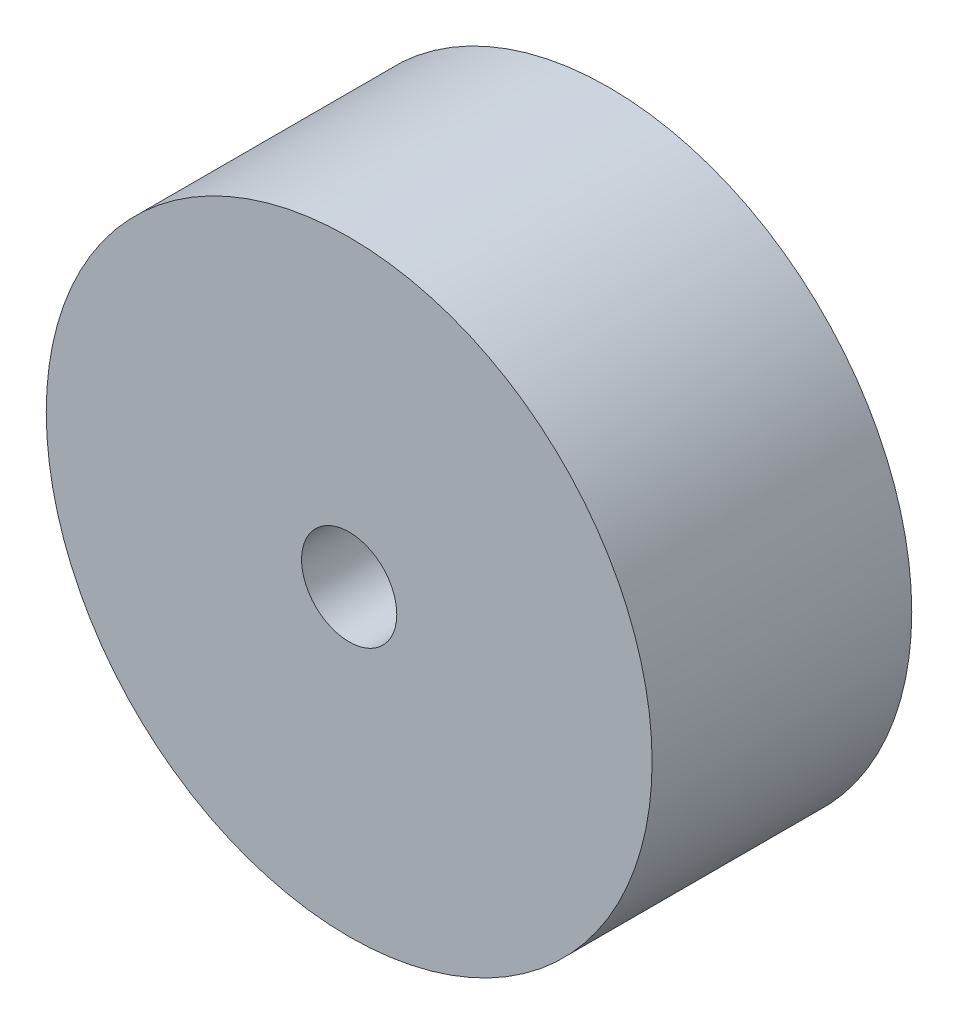
ISO-10303-21;
HEADER;
FILE_DESCRIPTION(('STEP AP214'),'2;1');
FILE_NAME('part.step','',(''),(''),'','','');
FILE_SCHEMA(('AUTOMOTIVE_DESIGN { 1 0 10303 214 1 1 1 1 }'));
ENDSEC;
DATA;
#1=APPLICATION_CONTEXT('core data for automotive mechanical design processes');
#2=APPLICATION_PROTOCOL_DEFINITION('international standard','automotive_design',2000,#1);
#3=PRODUCT_CONTEXT('',#1,'mechanical');
#4=PRODUCT('Part','Part','',(#3));
#5=PRODUCT_RELATED_PRODUCT_CATEGORY('part','',(#4));
#6=PRODUCT_DEFINITION_FORMATION('','',#4);
#7=PRODUCT_DEFINITION_CONTEXT('part definition',#1,'design');
#8=PRODUCT_DEFINITION('design','',#6,#7);
#9=PRODUCT_DEFINITION_SHAPE('','',#8);
#10=(LENGTH_UNIT() NAMED_UNIT(*) SI_UNIT(.MILLI.,.METRE.));
#11=(NAMED_UNIT(*) PLANE_ANGLE_UNIT() SI_UNIT($,.RADIAN.));
#12=(NAMED_UNIT(*) SI_UNIT($,.STERADIAN.) SOLID_ANGLE_UNIT());
#13=UNCERTAINTY_MEASURE_WITH_UNIT(LENGTH_MEASURE(1.E-05),#10,'distance_accuracy_value','');
#14=(GEOMETRIC_REPRESENTATION_CONTEXT(3) GLOBAL_UNCERTAINTY_ASSIGNED_CONTEXT((#13)) GLOBAL_UNIT_ASSIGNED_CONTEXT((#10,
#11,#12)) REPRESENTATION_CONTEXT('',''));
#15=CARTESIAN_POINT('',(0.,0.,0.));
#16=DIRECTION('',(0.,0.,1.));
#17=DIRECTION('',(1.,0.,0.));
#18=AXIS2_PLACEMENT_3D('',#15,#16,#17);
#19=CARTESIAN_POINT('',(-259.,74.5000000000001,0.));
#20=DIRECTION('',(0.,0.,1.));
#21=DIRECTION('',(1.,0.,0.));
#22=AXIS2_PLACEMENT_3D('',#19,#20,#21);
#23=PLANE('',#22);
#24=CARTESIAN_POINT('',(-259.,74.5000000000001,0.));
#25=DIRECTION('',(0.,0.,-1.));
#26=DIRECTION('',(-1.,0.,0.));
#27=AXIS2_PLACEMENT_3D('',#24,#25,#26);
#28=CIRCLE('',#27,10.5);
#29=CARTESIAN_POINT('',(-269.5,74.5000000000001,0.));
#30=VERTEX_POINT('',#29);
#31=EDGE_CURVE('E11',#30,#30,#28,.F.);
#32=ORIENTED_EDGE('',*,*,#31,.F.);
#33=EDGE_LOOP('',(#32));
#34=FACE_BOUND('',#33,.T.);
#35=ADVANCED_FACE('F40',(#34),#23,.F.);
#36=CARTESIAN_POINT('',(-259.,74.5000000000001,0.999999999976353));
#37=DIRECTION('',(0.,0.,1.));
#38=DIRECTION('',(1.,0.,0.));
#39=AXIS2_PLACEMENT_3D('',#36,#37,#38);
#40=CONICAL_SURFACE('',#39,1.65000000002602,1.02974425851131);
#41=CARTESIAN_POINT('',(-259.,74.5000000000001,0.00857997827097279));
#42=VERTEX_POINT('',#41);
#43=VERTEX_LOOP('',#42);
#44=FACE_BOUND('',#43,.T.);
#45=CARTESIAN_POINT('',(-259.,74.5000000000001,0.999999999999999));
#46=DIRECTION('',(0.,0.,1.));
#47=DIRECTION('',(1.,0.,0.));
#48=AXIS2_PLACEMENT_3D('',#45,#46,#47);
#49=CIRCLE('',#48,1.64999999999998);
#50=CARTESIAN_POINT('',(-257.35,74.5000000000001,0.999999999999999));
#51=VERTEX_POINT('',#50);
#52=EDGE_CURVE('E44',#51,#51,#49,.T.);
#53=ORIENTED_EDGE('',*,*,#52,.T.);
#54=EDGE_LOOP('',(#53));
#55=FACE_BOUND('',#54,.T.);
#56=ADVANCED_FACE('F52',(#44,#55),#40,.F.);
#57=CARTESIAN_POINT('',(-259.,74.5000000000001,9.00000000000001));
#58=DIRECTION('',(0.,0.,1.));
#59=DIRECTION('',(1.,0.,0.));
#60=AXIS2_PLACEMENT_3D('',#57,#58,#59);
#61=CYLINDRICAL_SURFACE('',#60,1.64999999999998);
#62=ORIENTED_EDGE('',*,*,#52,.F.);
#63=EDGE_LOOP('',(#62));
#64=FACE_BOUND('',#63,.T.);
#65=CARTESIAN_POINT('',(-259.,74.5000000000001,9.00000000000001));
#66=DIRECTION('',(0.,0.,1.));
#67=DIRECTION('',(1.,0.,0.));
#68=AXIS2_PLACEMENT_3D('',#65,#66,#67);
#69=CIRCLE('',#68,1.64999999999998);
#70=CARTESIAN_POINT('',(-257.35,74.5000000000001,9.00000000000001));
#71=VERTEX_POINT('',#70);
#72=EDGE_CURVE('E60',#71,#71,#69,.F.);
#73=ORIENTED_EDGE('',*,*,#72,.F.);
#74=EDGE_LOOP('',(#73));
#75=FACE_BOUND('',#74,.T.);
#76=ADVANCED_FACE('F55',(#64,#75),#61,.F.);
#77=CARTESIAN_POINT('',(-259.,74.5000000000001,9.00000000000001));
#78=DIRECTION('',(0.,0.,1.));
#79=DIRECTION('',(1.,0.,0.));
#80=AXIS2_PLACEMENT_3D('',#77,#78,#79);
#81=PLANE('',#80);
#82=CARTESIAN_POINT('',(-259.,74.5000000000001,9.00000000000001));
#83=DIRECTION('',(0.,0.,-1.));
#84=DIRECTION('',(-1.,0.,0.));
#85=AXIS2_PLACEMENT_3D('',#82,#83,#84);
#86=CIRCLE('',#85,10.5);
#87=CARTESIAN_POINT('',(-269.5,74.5000000000001,9.00000000000001));
#88=VERTEX_POINT('',#87);
#89=EDGE_CURVE('E48',#88,#88,#86,.T.);
#90=ORIENTED_EDGE('',*,*,#89,.F.);
#91=EDGE_LOOP('',(#90));
#92=FACE_BOUND('',#91,.T.);
#93=ORIENTED_EDGE('',*,*,#72,.T.);
#94=EDGE_LOOP('',(#93));
#95=FACE_BOUND('',#94,.T.);
#96=ADVANCED_FACE('F70',(#92,#95),#81,.T.);
#97=CARTESIAN_POINT('',(-259.,74.5000000000001,9.00000000000001));
#98=DIRECTION('',(0.,0.,-1.));
#99=DIRECTION('',(-1.,0.,0.));
#100=AXIS2_PLACEMENT_3D('',#97,#98,#99);
#101=CYLINDRICAL_SURFACE('',#100,10.5);
#102=ORIENTED_EDGE('',*,*,#89,.T.);
#103=EDGE_LOOP('',(#102));
#104=FACE_BOUND('',#103,.T.);
#105=ORIENTED_EDGE('',*,*,#31,.T.);
#106=EDGE_LOOP('',(#105));
#107=FACE_BOUND('',#106,.T.);
#108=ADVANCED_FACE('F42',(#104,#107),#101,.T.);
#109=CLOSED_SHELL('',(#35,#56,#76,#96,#108));
#110=MANIFOLD_SOLID_BREP('B2',#109);
#111=ADVANCED_BREP_SHAPE_REPRESENTATION('',(#18,#110),#14);
#112=SHAPE_DEFINITION_REPRESENTATION(#9,#111);
ENDSEC;
END-ISO-10303-21;
